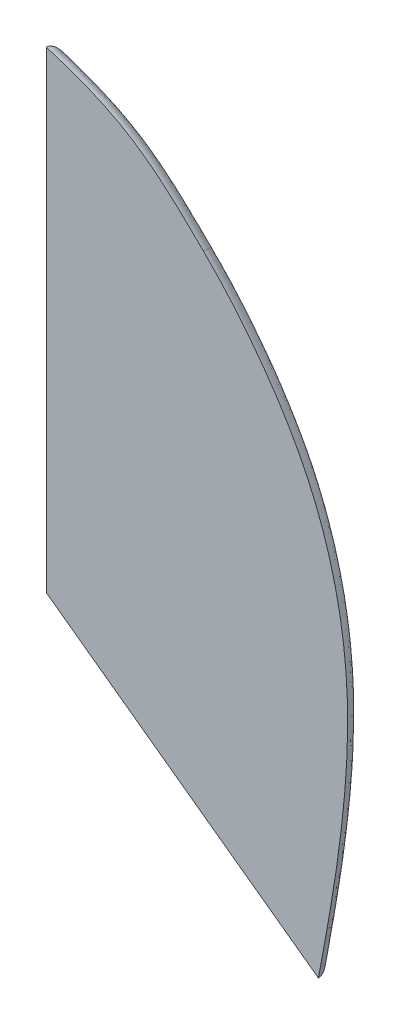
ISO-10303-21;
HEADER;
FILE_DESCRIPTION(('STEP AP214'),'2;1');
FILE_NAME('part.step','',(''),(''),'','','');
FILE_SCHEMA(('AUTOMOTIVE_DESIGN { 1 0 10303 214 1 1 1 1 }'));
ENDSEC;
DATA;
#1=APPLICATION_CONTEXT('core data for automotive mechanical design processes');
#2=APPLICATION_PROTOCOL_DEFINITION('international standard','automotive_design',2000,#1);
#3=PRODUCT_CONTEXT('',#1,'mechanical');
#4=PRODUCT('Part','Part','',(#3));
#5=PRODUCT_RELATED_PRODUCT_CATEGORY('part','',(#4));
#6=PRODUCT_DEFINITION_FORMATION('','',#4);
#7=PRODUCT_DEFINITION_CONTEXT('part definition',#1,'design');
#8=PRODUCT_DEFINITION('design','',#6,#7);
#9=PRODUCT_DEFINITION_SHAPE('','',#8);
#10=(LENGTH_UNIT() NAMED_UNIT(*) SI_UNIT(.MILLI.,.METRE.));
#11=(NAMED_UNIT(*) PLANE_ANGLE_UNIT() SI_UNIT($,.RADIAN.));
#12=(NAMED_UNIT(*) SI_UNIT($,.STERADIAN.) SOLID_ANGLE_UNIT());
#13=UNCERTAINTY_MEASURE_WITH_UNIT(LENGTH_MEASURE(1.E-05),#10,'distance_accuracy_value','');
#14=(GEOMETRIC_REPRESENTATION_CONTEXT(3) GLOBAL_UNCERTAINTY_ASSIGNED_CONTEXT((#13)) GLOBAL_UNIT_ASSIGNED_CONTEXT((#10,
#11,#12)) REPRESENTATION_CONTEXT('',''));
#15=CARTESIAN_POINT('',(0.,0.,0.));
#16=DIRECTION('',(0.,0.,1.));
#17=DIRECTION('',(1.,0.,0.));
#18=AXIS2_PLACEMENT_3D('',#15,#16,#17);
#19=CARTESIAN_POINT('',(125.590450076123,82.7587097255462,-1.14601855698823));
#20=DIRECTION('',(-0.809093584960124,0.587679819752122,-1.52475673134034E-05));
#21=DIRECTION('',(-0.415552384184587,-0.572133904193624,-0.707091940040803));
#22=AXIS2_PLACEMENT_3D('',#19,#20,#21);
#23=CYLINDRICAL_SURFACE('',#22,0.999999996270512);
#24=CARTESIAN_POINT('',(126.811863852623,81.8715438384854,-1.14599553580279));
#25=DIRECTION('',(-0.454048551687804,0.89097694256128,-2.31162691799491E-05));
#26=DIRECTION('',(-0.890976942861154,-0.454048551535003,1.1779567082714E-05));
#27=AXIS2_PLACEMENT_3D('',#24,#25,#26);
#28=ELLIPSE('',#27,1.12236349967131,0.999999999716051);
#29=CARTESIAN_POINT('',(126.811863852476,81.8715178975269,-2.14599553517501));
#30=VERTEX_POINT('',#29);
#31=CARTESIAN_POINT('',(125.811863851931,81.3619363190776,-1.14598231678155));
#32=VERTEX_POINT('',#31);
#33=EDGE_CURVE('E119',#30,#32,#28,.T.);
#34=ORIENTED_EDGE('',*,*,#33,.F.);
#35=DIRECTION('',(0.809093584947611,-0.58767981976935,1.524751426917E-05));
#36=VECTOR('',#35,1.);
#37=CARTESIAN_POINT('',(126.811863845189,81.8715179042601,-2.1459955351715));
#38=LINE('',#37,#36);
#39=CARTESIAN_POINT('',(143.791252344595,69.5386504092643,-2.1456755555384));
#40=VERTEX_POINT('',#39);
#41=EDGE_CURVE('E114',#30,#40,#38,.T.);
#42=ORIENTED_EDGE('',*,*,#41,.T.);
#43=CARTESIAN_POINT('',(144.482318319635,67.8007741785824,-1.14563046641121));
#44=CARTESIAN_POINT('',(144.482318336508,67.8007739689964,-1.15058067866123));
#45=CARTESIAN_POINT('',(144.482293002308,67.8008377007775,-1.15553090035431));
#46=CARTESIAN_POINT('',(144.482191871961,67.801092397399,-1.1654188458489));
#47=CARTESIAN_POINT('',(144.482116164599,67.8012831383753,-1.17035657632306));
#48=CARTESIAN_POINT('',(144.481924036355,67.8017672454629,-1.17975907664245));
#49=CARTESIAN_POINT('',(144.481812129172,67.8020492348666,-1.18422452805021));
#50=CARTESIAN_POINT('',(144.481520211337,67.8027849456108,-1.19406132727275));
#51=CARTESIAN_POINT('',(144.481330940507,67.8032620261052,-1.19943064553435));
#52=CARTESIAN_POINT('',(144.480749596651,67.8047273087882,-1.21367494042187));
#53=CARTESIAN_POINT('',(144.480305987994,67.8058453693435,-1.22253494444766));
#54=CARTESIAN_POINT('',(144.479467465317,67.8079594717313,-1.23668759127187));
#55=CARTESIAN_POINT('',(144.479122900127,67.8088283342445,-1.24200275515122));
#56=CARTESIAN_POINT('',(144.478374848225,67.8107139180863,-1.25263132892385));
#57=CARTESIAN_POINT('',(144.477971064377,67.811731384941,-1.25794458591091));
#58=CARTESIAN_POINT('',(144.476838241383,67.8145865796568,-1.27183373732352));
#59=CARTESIAN_POINT('',(144.476063172631,67.8165407130372,-1.28038221244633));
#60=CARTESIAN_POINT('',(144.47435969065,67.8208362420828,-1.2974743124396));
#61=CARTESIAN_POINT('',(144.473429568694,67.8231819534933,-1.30601667877199));
#62=CARTESIAN_POINT('',(144.471619303391,67.8277462336005,-1.32136063128442));
#63=CARTESIAN_POINT('',(144.470763484654,67.8299036669188,-1.32818337767669));
#64=CARTESIAN_POINT('',(144.468953226796,67.8344666156451,-1.34181547156111));
#65=CARTESIAN_POINT('',(144.467997821985,67.8368745597349,-1.34862387771123));
#66=CARTESIAN_POINT('',(144.465988478003,67.8419380967301,-1.36222278747765));
#67=CARTESIAN_POINT('',(144.464933545395,67.8445961856076,-1.36901221496943));
#68=CARTESIAN_POINT('',(144.462837231805,67.8498804063157,-1.38188444221119));
#69=CARTESIAN_POINT('',(144.461803106259,67.8524880606838,-1.38797604776079));
#70=CARTESIAN_POINT('',(144.458554345665,67.8606827243366,-1.40637510781812));
#71=CARTESIAN_POINT('',(144.456232713377,67.8665422255164,-1.4185435870602));
#72=CARTESIAN_POINT('',(144.451260232769,67.8790881765733,-1.44284283856432));
#73=CARTESIAN_POINT('',(144.448601732688,67.8857938227941,-1.45496206404236));
#74=CARTESIAN_POINT('',(144.442953571024,67.9000330963816,-1.4791368439916));
#75=CARTESIAN_POINT('',(144.439956352885,67.9075855637158,-1.49117951468662));
#76=CARTESIAN_POINT('',(144.433631449704,67.9235191511031,-1.51517251784532));
#77=CARTESIAN_POINT('',(144.430296456663,67.9319185615506,-1.52710873614414));
#78=CARTESIAN_POINT('',(144.423296993576,67.949543668366,-1.55086259909285));
#79=CARTESIAN_POINT('',(144.419625523696,67.958786885291,-1.56266516021873));
#80=CARTESIAN_POINT('',(144.412647795035,67.9763822603494,-1.58402045652676));
#81=CARTESIAN_POINT('',(144.409369672729,67.9846593123684,-1.59364456333861));
#82=CARTESIAN_POINT('',(144.402556302033,68.001883335318,-1.61288634668722));
#83=CARTESIAN_POINT('',(144.399016019849,68.0108437949294,-1.62249015214498));
#84=CARTESIAN_POINT('',(144.391670845877,68.0294342430514,-1.64167192874667));
#85=CARTESIAN_POINT('',(144.387861010428,68.0390767366544,-1.6512358584275));
#86=CARTESIAN_POINT('',(144.379971940413,68.059033612534,-1.67031578013776));
#87=CARTESIAN_POINT('',(144.375887945715,68.0693596831199,-1.67981755742893));
#88=CARTESIAN_POINT('',(144.367446762555,68.0906848706264,-1.69875064306884));
#89=CARTESIAN_POINT('',(144.363085019231,68.1016948794152,-1.70816763103557));
#90=CARTESIAN_POINT('',(144.354086169276,68.1243889839354,-1.72690769039866));
#91=CARTESIAN_POINT('',(144.349444752203,68.1360832376231,-1.73621637113935));
#92=CARTESIAN_POINT('',(144.339885977638,68.1601464271054,-1.75471575684966));
#93=CARTESIAN_POINT('',(144.334964586275,68.1725248368328,-1.76389203551853));
#94=CARTESIAN_POINT('',(144.324846992115,68.1979565383402,-1.782102065529));
#95=CARTESIAN_POINT('',(144.319647062893,68.2110186697712,-1.79112138354279));
#96=CARTESIAN_POINT('',(144.308975392566,68.2378176699786,-1.80899255218579));
#97=CARTESIAN_POINT('',(144.303500263898,68.2515627926034,-1.8178299859571));
#98=CARTESIAN_POINT('',(144.292282770825,68.2797269396043,-1.83531251135445));
#99=CARTESIAN_POINT('',(144.286537375447,68.2941536662737,-1.84394323294948));
#100=CARTESIAN_POINT('',(144.274786975946,68.3236808345079,-1.86098660238584));
#101=CARTESIAN_POINT('',(144.268779356505,68.3387884987565,-1.86938492233365));
#102=CARTESIAN_POINT('',(144.257235426763,68.3678458900955,-1.88496207255228));
#103=CARTESIAN_POINT('',(144.251705880389,68.3817761286315,-1.89218237747198));
#104=CARTESIAN_POINT('',(144.240334480251,68.4104203970516,-1.90656108576361));
#105=CARTESIAN_POINT('',(144.234489660258,68.425141767041,-1.91370250887938));
#106=CARTESIAN_POINT('',(144.222484918447,68.4553699623733,-1.92788816983891));
#107=CARTESIAN_POINT('',(144.216322147949,68.47088361514,-1.93491543269175));
#108=CARTESIAN_POINT('',(144.203680101432,68.5026964906788,-1.94883721907061));
#109=CARTESIAN_POINT('',(144.197198127927,68.5190020505324,-1.95571479222397));
#110=CARTESIAN_POINT('',(144.183919596831,68.5523988927747,-1.96930035942809));
#111=CARTESIAN_POINT('',(144.177120596251,68.5694961023158,-1.97599140268403));
#112=CARTESIAN_POINT('',(144.166784360635,68.5954904816259,-1.98578277977754));
#113=CARTESIAN_POINT('',(144.163267916473,68.6043342960307,-1.98904770309465));
#114=CARTESIAN_POINT('',(144.156839128202,68.6205085756085,-1.99489951596846));
#115=CARTESIAN_POINT('',(144.153928745562,68.6278330656892,-1.99750508214723));
#116=CARTESIAN_POINT('',(144.144868274824,68.6506403281161,-2.005483591241));
#117=CARTESIAN_POINT('',(144.138703854869,68.6661647053091,-2.01072188297141));
#118=CARTESIAN_POINT('',(144.125910995815,68.6983716714039,-2.0212121423817));
#119=CARTESIAN_POINT('',(144.1192796807,68.7150607935276,-2.02644049655536));
#120=CARTESIAN_POINT('',(144.105549346786,68.7495985221784,-2.03684924908729));
#121=CARTESIAN_POINT('',(144.098447435568,68.7674532878438,-2.04200539185285));
#122=CARTESIAN_POINT('',(144.08377474042,68.8043210532501,-2.05220581504935));
#123=CARTESIAN_POINT('',(144.076201176207,68.8233398215422,-2.05722523368008));
#124=CARTESIAN_POINT('',(144.06059816626,68.8625373496911,-2.06708278305968));
#125=CARTESIAN_POINT('',(144.052566796954,68.8827217844542,-2.0718952966537));
#126=CARTESIAN_POINT('',(144.037024473378,68.9217455288353,-2.08071712222869));
#127=CARTESIAN_POINT('',(144.029516960163,68.9405788271365,-2.08475918301449));
#128=CARTESIAN_POINT('',(144.014472271716,68.9782608065273,-2.09243053555223));
#129=CARTESIAN_POINT('',(144.006935218041,68.9971093306688,-2.09606083676565));
#130=CARTESIAN_POINT('',(143.99185914446,69.0348208563451,-2.10291184660509));
#131=CARTESIAN_POINT('',(143.984320181667,69.0536836899523,-2.10613360555579));
#132=CARTESIAN_POINT('',(143.969259680057,69.0914194870547,-2.11217485333849));
#133=CARTESIAN_POINT('',(143.961738149879,69.1102922822178,-2.11499541667848));
#134=CARTESIAN_POINT('',(143.946728676001,69.1480432490821,-2.12024279628622));
#135=CARTESIAN_POINT('',(143.939240697432,69.166921255151,-2.12267070179589));
#136=CARTESIAN_POINT('',(143.928049506968,69.1952641018923,-2.12602486165943));
#137=CARTESIAN_POINT('',(143.924329912146,69.2047057859193,-2.12709396263678));
#138=CARTESIAN_POINT('',(143.916717566631,69.2240268881837,-2.12918781012365));
#139=CARTESIAN_POINT('',(143.912824631962,69.2339066916546,-2.13020833023345));
#140=CARTESIAN_POINT('',(143.901128944345,69.2635168558312,-2.13312163533604));
#141=CARTESIAN_POINT('',(143.893296774385,69.2832500124677,-2.13486994600903));
#142=CARTESIAN_POINT('',(143.877605463052,69.3226831512686,-2.13797229935362));
#143=CARTESIAN_POINT('',(143.869746426358,69.3423831042337,-2.13932724700177));
#144=CARTESIAN_POINT('',(143.854018665135,69.3817444741933,-2.14164478226537));
#145=CARTESIAN_POINT('',(143.846150015012,69.4014058630905,-2.14260835069177));
#146=CARTESIAN_POINT('',(143.830424790264,69.4406865531956,-2.14414564515741));
#147=CARTESIAN_POINT('',(143.822568241018,69.4603058233973,-2.14472042456879));
#148=CARTESIAN_POINT('',(143.806887316982,69.4994983853095,-2.1454846657758));
#149=CARTESIAN_POINT('',(143.79906291515,69.5190716443962,-2.14567524556229));
#150=CARTESIAN_POINT('',(143.791252344052,69.5386504070282,-2.14567555553834));
#151=B_SPLINE_CURVE_WITH_KNOTS('',3,(#43,#44,#45,#46,#47,#48,#49,#50,#51,#52,#53,#54,#55,#56,
#57,#58,#59,#60,#61,#62,#63,#64,#65,#66,#67,#68,#69,#70,#71,#72,#73,#74,#75,#76,#77,#78,#79,#80,
#81,#82,#83,#84,#85,#86,#87,#88,#89,#90,#91,#92,#93,#94,#95,#96,#97,#98,#99,#100,#101,#102,#103,
#104,#105,#106,#107,#108,#109,#110,#111,#112,#113,#114,#115,#116,#117,#118,#119,#120,#121,#122,
#123,#124,#125,#126,#127,#128,#129,#130,#131,#132,#133,#134,#135,#136,#137,#138,#139,#140,#141,
#142,#143,#144,#145,#146,#147,#148,#149,#150),.UNSPECIFIED.,.F.,.F.,(4,2,2,2,2,2,2,2,2,2,2,2,2,
2,2,2,2,2,2,2,2,2,2,2,2,2,2,2,2,2,2,2,2,2,2,2,2,2,2,2,2,2,2,2,2,2,2,2,2,2,2,2,2,4),(0.,
0.0148501783463098,0.0296742510803923,0.043100093412507,0.0592793611188259,0.0860908196663251,
0.102279009523456,0.118551395977413,0.144950870834394,0.171663263997182,0.193278952420791,
0.215128201681626,0.23722491424751,0.257341699164225,0.298425897460246,0.340713613852489,
0.384273504745195,0.429166976284399,0.475448849916804,0.514768991354456,0.555568814812865,
0.59787479252804,0.641709183206085,0.687090499625878,0.734033926490721,0.782551694517738,
0.832653416634358,0.884346391731083,0.937635880838095,0.992525359944843,1.0424283831541,
1.09454695913692,1.1488765320327,1.2054101622761,1.26413869188339,1.29432318763931,
1.31922598071249,1.3717388226357,1.42784662540542,1.48752737664726,1.55075517831555,
1.61750021700445,1.6795166705403,1.74137764028678,1.80307619977326,1.86460627054508,
1.92596261392885,1.95657456092349,1.98857826307791,2.05248184354134,2.11623721984398,
2.17983182211097,2.24325342561419,2.30649020926803),.UNSPECIFIED.);
#152=CARTESIAN_POINT('',(144.482318312743,67.8007741630058,-1.14563046676126));
#153=VERTEX_POINT('',#152);
#154=EDGE_CURVE('E11',#153,#40,#151,.T.);
#155=ORIENTED_EDGE('',*,*,#154,.F.);
#156=DIRECTION('',(-0.809093584947609,0.587679819769348,-1.52477245357374E-05));
#157=VECTOR('',#156,1.);
#158=CARTESIAN_POINT('',(144.482318304735,67.800774158147,-1.14563046746204));
#159=LINE('',#158,#157);
#160=EDGE_CURVE('E104',#153,#32,#159,.T.);
#161=ORIENTED_EDGE('',*,*,#160,.T.);
#162=EDGE_LOOP('',(#34,#42,#155,#161));
#163=FACE_BOUND('',#162,.T.);
#164=ADVANCED_FACE('F40',(#163),#23,.T.);
#165=CARTESIAN_POINT('',(144.482318319635,67.8007741785824,-1.14563046641121));
#166=CARTESIAN_POINT('',(145.213123430634,71.654923868336,-1.14573046024207));
#167=CARTESIAN_POINT('',(146.321803906748,77.7966914906592,-1.14588980511302));
#168=CARTESIAN_POINT('',(146.694942994877,87.4595978575819,-1.14614050475584));
#169=CARTESIAN_POINT('',(144.922204221095,95.6294993400638,-1.14635247016296));
#170=CARTESIAN_POINT('',(141.637842445866,101.056520583461,-1.14649327354055));
#171=CARTESIAN_POINT('',(139.541330290064,103.780432607108,-1.1465639453254));
#172=CARTESIAN_POINT('',(138.33236116076,105.266187251436,-1.14660249320236));
#173=CARTESIAN_POINT('',(137.24414315842,106.41628000436,-1.14663233241689));
#174=CARTESIAN_POINT('',(136.591131158806,107.056283775076,-1.14664893737178));
#175=CARTESIAN_POINT('',(144.482318320295,67.8007482339977,-2.14563046607464));
#176=CARTESIAN_POINT('',(145.213123431006,71.6548979234805,-2.1457304599055));
#177=CARTESIAN_POINT('',(146.321803907384,77.7966655465286,-2.14588980477645));
#178=CARTESIAN_POINT('',(146.694942995333,87.459571912568,-2.14614050441928));
#179=CARTESIAN_POINT('',(144.922204221634,95.6294733959754,-2.14635246982644));
#180=CARTESIAN_POINT('',(141.637842446406,101.056494638617,-2.14649327320399));
#181=CARTESIAN_POINT('',(139.541330290578,103.78040666263,-2.14656394498887));
#182=CARTESIAN_POINT('',(138.332361161287,105.266161306808,-2.14660249286579));
#183=CARTESIAN_POINT('',(137.244143158936,106.416254059839,-2.14663233208036));
#184=CARTESIAN_POINT('',(136.591131159327,107.056257830518,-2.14664893703524));
#185=CARTESIAN_POINT('',(143.499935123893,67.9876258822134,-2.14563531504379));
#186=CARTESIAN_POINT('',(144.228772451117,71.8324129215384,-2.14573506596585));
#187=CARTESIAN_POINT('',(145.329139543959,77.9341427586998,-2.14589337207847));
#188=CARTESIAN_POINT('',(145.686027992747,87.3899093908195,-2.14613869758086));
#189=CARTESIAN_POINT('',(143.974847296871,95.2507333355182,-2.14634264407579));
#190=CARTESIAN_POINT('',(140.804319546754,100.500859782968,-2.14647885793674));
#191=CARTESIAN_POINT('',(138.76244030875,103.153073441316,-2.14654766951083));
#192=CARTESIAN_POINT('',(137.565959325887,104.621977642148,-2.14658578020392));
#193=CARTESIAN_POINT('',(136.547267388168,105.697229915292,-2.14661367767915));
#194=CARTESIAN_POINT('',(135.874594773373,106.358708113811,-2.14663083978878));
#195=(BOUNDED_SURFACE() B_SPLINE_SURFACE(2,3,((#165,#166,#167,#168,#169,#170,#171,#172,#173,
#174),(#175,#176,#177,#178,#179,#180,#181,#182,#183,#184),(#185,#186,#187,#188,#189,#190,#191,
#192,#193,#194)),.UNSPECIFIED.,.F.,.F.,.F.) B_SPLINE_SURFACE_WITH_KNOTS((3,3),(4,1,1,1,1,1,1,4),
(0.,1.57079632700827),(-1.0797520247796E-10,11.7431313152028,18.5717809273118,28.2978183978038,
35.5405647191903,36.7544778082343,38.3796799892132,41.2057858997997),
.UNSPECIFIED.) GEOMETRIC_REPRESENTATION_ITEM() RATIONAL_B_SPLINE_SURFACE(((1.,1.,1.,1.,1.,1.,1.,
1.,1.,1.),(0.707106781111109,0.707106781237663,0.707106781161074,0.707106781197957,
0.707106781177582,0.707106781187554,0.70710678118583,0.707106781187182,0.707106781186161,
0.707106781186557),(1.,1.,1.,1.,1.,1.,1.,1.,1.,1.))) REPRESENTATION_ITEM('') SURFACE());
#196=CARTESIAN_POINT('',(143.79125234464,69.5386504105194,-2.14567555553843));
#197=CARTESIAN_POINT('',(144.40954241628,72.8702531569204,-2.14576199217823));
#198=CARTESIAN_POINT('',(145.349044719331,78.4615307807123,-2.14590705491737));
#199=CARTESIAN_POINT('',(145.686027992747,87.3899093908195,-2.14613869758086));
#200=CARTESIAN_POINT('',(143.974847296871,95.2507333355182,-2.14634264407579));
#201=CARTESIAN_POINT('',(140.804319546754,100.500859782968,-2.14647885793674));
#202=CARTESIAN_POINT('',(138.76244030875,103.153073441316,-2.14654766951083));
#203=CARTESIAN_POINT('',(137.579088860564,104.605858682534,-2.1465853619978));
#204=CARTESIAN_POINT('',(136.575706209772,105.667180529512,-2.14661289804632));
#205=CARTESIAN_POINT('',(135.918948305754,106.315024772984,-2.14662970642072));
#206=(BOUNDED_CURVE() B_SPLINE_CURVE(3,(#196,#197,#198,#199,#200,#201,#202,#203,#204,#205),
.UNSPECIFIED.,.F.,.F.) B_SPLINE_CURVE_WITH_KNOTS((4,1,1,1,1,1,1,4),(1.57828878944919,
11.7431313152028,18.5717809273118,28.2978183978038,35.5405647191903,36.7544778082343,
38.3796799892132,41.1436188290223),
.UNSPECIFIED.) CURVE() GEOMETRIC_REPRESENTATION_ITEM() RATIONAL_B_SPLINE_CURVE((1.,1.,1.,1.,1.,
1.,1.,1.,1.,1.)) REPRESENTATION_ITEM(''));
#207=CARTESIAN_POINT('',(135.918933669779,106.315011061286,-2.14662970606499));
#208=VERTEX_POINT('',#207);
#209=EDGE_CURVE('E92',#40,#208,#206,.T.);
#210=CARTESIAN_POINT('',(135.918947807492,106.315025264483,-2.14662970643348));
#211=CARTESIAN_POINT('',(135.929089161937,106.32589719804,-2.1466302308001));
#212=CARTESIAN_POINT('',(135.939235417158,106.336764575145,-2.14629889548868));
#213=CARTESIAN_POINT('',(135.959694200064,106.358661042221,-2.14496250956649));
#214=CARTESIAN_POINT('',(135.970006514501,106.369689615832,-2.14394571552296));
#215=CARTESIAN_POINT('',(135.990767485053,106.391879154069,-2.14120563798652));
#216=CARTESIAN_POINT('',(136.001215544771,106.403039256925,-2.13947084842009));
#217=CARTESIAN_POINT('',(136.022215003021,106.425459525426,-2.13526531703195));
#218=CARTESIAN_POINT('',(136.03276543931,106.436718500822,-2.13278342016633));
#219=CARTESIAN_POINT('',(136.053933695506,106.459301322148,-2.12705767934227));
#220=CARTESIAN_POINT('',(136.064550214643,106.470623676159,-2.12380313861585));
#221=CARTESIAN_POINT('',(136.085811951989,106.493295411905,-2.11651032018336));
#222=CARTESIAN_POINT('',(136.096455569243,106.50464303719,-2.11246191210762));
#223=CARTESIAN_POINT('',(136.117730374802,106.527325104994,-2.10356432682265));
#224=CARTESIAN_POINT('',(136.128359711275,106.538657574055,-2.09870568909749));
#225=CARTESIAN_POINT('',(136.149562743926,106.561267104401,-2.08817592587661));
#226=CARTESIAN_POINT('',(136.160134397388,106.572542032807,-2.08249610604727));
#227=CARTESIAN_POINT('',(136.181177198137,106.594992662211,-2.07031805704335));
#228=CARTESIAN_POINT('',(136.19164618174,106.606166137797,-2.06381198557748));
#229=CARTESIAN_POINT('',(136.212437613487,106.628368930146,-2.04998171669203));
#230=CARTESIAN_POINT('',(136.222757855577,106.639396003968,-2.04265060138308));
#231=CARTESIAN_POINT('',(136.243205162113,106.661260480457,-2.02717704425373));
#232=CARTESIAN_POINT('',(136.253330063786,106.672095704098,-2.01902866498127));
#233=CARTESIAN_POINT('',(136.27334001104,106.693530979359,-2.00193409286904));
#234=CARTESIAN_POINT('',(136.283223027607,106.704129001877,-1.99298298031027));
#235=CARTESIAN_POINT('',(136.302703161872,106.725044933058,-1.97430324822172));
#236=CARTESIAN_POINT('',(136.3122984776,106.735361050284,-1.96457074346776));
#237=CARTESIAN_POINT('',(136.331158241873,106.7556696251,-1.94435524682815));
#238=CARTESIAN_POINT('',(136.340421207625,106.765660617215,-1.93386939915073));
#239=CARTESIAN_POINT('',(136.358573742121,106.785276586433,-1.91218083481145));
#240=CARTESIAN_POINT('',(136.367462238937,106.794900506201,-1.90097626492825));
#241=CARTESIAN_POINT('',(136.384823603238,106.813744836664,-1.87788983510508));
#242=CARTESIAN_POINT('',(136.393295889427,106.822964681177,-1.86600707536401));
#243=CARTESIAN_POINT('',(136.408674149328,106.839736216351,-1.84326613471447));
#244=CARTESIAN_POINT('',(136.415636654267,106.847344491582,-1.83248774706201));
#245=CARTESIAN_POINT('',(136.429353990351,106.862356529554,-1.81026109599164));
#246=CARTESIAN_POINT('',(136.436101908006,106.869753184889,-1.79880375872202));
#247=CARTESIAN_POINT('',(136.449344017483,106.884300137145,-1.77522941172739));
#248=CARTESIAN_POINT('',(136.45583124102,106.891443381206,-1.76310413585329));
#249=CARTESIAN_POINT('',(136.468507798583,106.90543963956,-1.73821055080506));
#250=CARTESIAN_POINT('',(136.474690259804,106.912285723533,-1.72543484394726));
#251=CARTESIAN_POINT('',(136.486712853047,106.925644616402,-1.69926404335023));
#252=CARTESIAN_POINT('',(136.492546312287,106.932150735954,-1.68586246886822));
#253=CARTESIAN_POINT('',(136.50382763764,106.944787527424,-1.65847059473672));
#254=CARTESIAN_POINT('',(136.509269154497,106.950911863256,-1.64447475640995));
#255=CARTESIAN_POINT('',(136.519725002864,106.962744647736,-1.61593200470419));
#256=CARTESIAN_POINT('',(136.524733430738,106.968447230056,-1.60138049620592));
#257=CARTESIAN_POINT('',(136.534283956016,106.97939845274,-1.57177081966698));
#258=CARTESIAN_POINT('',(136.538820716608,106.984641810242,-1.55670897598016));
#259=CARTESIAN_POINT('',(136.547391896135,106.994639610155,-1.5261294270917));
#260=CARTESIAN_POINT('',(136.551421660371,106.999389461074,-1.51060891578677));
#261=CARTESIAN_POINT('',(136.558946639617,107.008368999854,-1.47916866002185));
#262=CARTESIAN_POINT('',(136.562437987646,107.012594885615,-1.46324690395321));
#263=CARTESIAN_POINT('',(136.568858332307,107.020499558017,-1.43106590811743));
#264=CARTESIAN_POINT('',(136.571784341685,107.024175416454,-1.41480535301656));
#265=CARTESIAN_POINT('',(136.577051135469,107.030957917124,-1.38201277940043));
#266=CARTESIAN_POINT('',(136.579389887342,107.034062572746,-1.36548002350737));
#267=CARTESIAN_POINT('',(136.583464627714,107.039685763278,-1.33221237065057));
#268=CARTESIAN_POINT('',(136.585199593491,107.042203301342,-1.31547717991699));
#269=CARTESIAN_POINT('',(136.588054895663,107.046640891032,-1.28187622765066));
#270=CARTESIAN_POINT('',(136.589175252349,107.048560962382,-1.2650104704471));
#271=CARTESIAN_POINT('',(136.59079516675,107.05179780987,-1.23122108228913));
#272=CARTESIAN_POINT('',(136.591295797998,107.05311562677,-1.21429760248132));
#273=CARTESIAN_POINT('',(136.591676363168,107.05514827836,-1.18046549712301));
#274=CARTESIAN_POINT('',(136.591558409589,107.055865155572,-1.16355701799142));
#275=CARTESIAN_POINT('',(136.591131158806,107.056283775076,-1.14664893737178));
#276=B_SPLINE_CURVE_WITH_KNOTS('',3,(#210,#211,#212,#213,#214,#215,#216,#217,#218,#219,#220,
#221,#222,#223,#224,#225,#226,#227,#228,#229,#230,#231,#232,#233,#234,#235,#236,#237,#238,#239,
#240,#241,#242,#243,#244,#245,#246,#247,#248,#249,#250,#251,#252,#253,#254,#255,#256,#257,#258,
#259,#260,#261,#262,#263,#264,#265,#266,#267,#268,#269,#270,#271,#272,#273,#274,#275),
.UNSPECIFIED.,.F.,.F.,(4,2,2,2,2,2,2,2,2,2,2,2,2,2,2,2,2,2,2,2,2,2,2,2,2,2,2,2,2,2,2,2,4),(0.,
0.0445991902026963,0.0899825634478636,0.136123250153619,0.182990255289048,0.230548413746825,
0.278758394090898,0.32757675517949,0.376956059228015,0.426845043702858,0.477188853046201,
0.527929329667121,0.579005361951394,0.630353285308595,0.681907330567821,0.733600112444209,
0.785363149398879,0.830101621302767,0.875732561444587,0.922204487708636,0.969460500240784,
1.01743845315485,1.06607121764613,1.11528703764257,1.16500997626845,1.21516044834775,
1.26565583108412,1.31641114208664,1.36733977124373,1.41835425074273,1.4693670459356,
1.52029134886681,1.57104185616874),.UNSPECIFIED.);
#277=CARTESIAN_POINT('',(136.591131000824,107.056283927313,-1.14664896070818));
#278=VERTEX_POINT('',#277);
#279=EDGE_CURVE('E53',#208,#278,#276,.T.);
#280=CARTESIAN_POINT('',(136.591131473377,107.056283466772,-1.14664893736378));
#281=CARTESIAN_POINT('',(137.244143380302,106.416279769862,-1.1466323324108));
#282=CARTESIAN_POINT('',(138.332361257602,105.266187132423,-1.14660249319927));
#283=CARTESIAN_POINT('',(139.541330290064,103.780432607108,-1.1465639453254));
#284=CARTESIAN_POINT('',(141.637842445866,101.056520583461,-1.14649327354055));
#285=CARTESIAN_POINT('',(144.922204221095,95.6294993400638,-1.14635247016296));
#286=CARTESIAN_POINT('',(146.694942994877,87.4595978575819,-1.14614050475584));
#287=CARTESIAN_POINT('',(146.321803906749,77.7966914906961,-1.14588980511302));
#288=CARTESIAN_POINT('',(145.213123430647,71.6549238684074,-1.14573046024208));
#289=CARTESIAN_POINT('',(144.482318319655,67.8007741786888,-1.14563046641121));
#290=(BOUNDED_CURVE() B_SPLINE_CURVE(3,(#280,#281,#282,#283,#284,#285,#286,#287,#288,#289),
.UNSPECIFIED.,.F.,.F.) B_SPLINE_CURVE_WITH_KNOTS((4,1,1,1,1,1,1,4),(-41.2057854460001,
-38.3796799892132,-36.7544778082343,-35.5405647191903,-28.2978183978038,-18.5717809273118,
-11.7431313152028,0.),
.UNSPECIFIED.) CURVE() GEOMETRIC_REPRESENTATION_ITEM() RATIONAL_B_SPLINE_CURVE((1.,1.,1.,1.,1.,
1.,1.,1.,1.,1.)) REPRESENTATION_ITEM(''));
#291=EDGE_CURVE('E90',#278,#153,#290,.T.);
#292=ORIENTED_EDGE('',*,*,#154,.T.);
#293=ORIENTED_EDGE('',*,*,#209,.T.);
#294=ORIENTED_EDGE('',*,*,#279,.T.);
#295=ORIENTED_EDGE('',*,*,#291,.T.);
#296=EDGE_LOOP('',(#292,#293,#294,#295));
#297=FACE_BOUND('',#296,.T.);
#298=ADVANCED_FACE('F88',(#297),#195,.T.);
#299=CARTESIAN_POINT('',(136.619493956167,107.028453714624,-1.14664821531906));
#300=CARTESIAN_POINT('',(135.858621189907,107.770926932868,-1.14666747884023));
#301=CARTESIAN_POINT('',(134.391719524007,109.224536377912,-1.14670519288493));
#302=CARTESIAN_POINT('',(132.249953675655,110.960440522982,-1.14675023124762));
#303=CARTESIAN_POINT('',(129.384616752772,112.596035261708,-1.14679266753042));
#304=CARTESIAN_POINT('',(127.342002064282,113.331103058262,-1.14681173959532));
#305=CARTESIAN_POINT('',(125.811863852794,113.784362277247,-1.14682350000457));
#306=CARTESIAN_POINT('',(136.619493956687,107.028427770066,-2.14664821498221));
#307=CARTESIAN_POINT('',(135.858621187514,107.770900989942,-2.14666747851056));
#308=CARTESIAN_POINT('',(134.39171953155,109.224510430334,-2.14670519254189));
#309=CARTESIAN_POINT('',(132.249953669224,110.960414580264,-2.14675023091358));
#310=CARTESIAN_POINT('',(129.384616761712,112.596009316978,-2.14679266719183));
#311=CARTESIAN_POINT('',(127.342002055847,113.331077110244,-2.14681173926018));
#312=CARTESIAN_POINT('',(125.81186385583,113.784336341303,-2.14682349966828));
#313=CARTESIAN_POINT('',(135.918846166126,106.314920466362,-2.14662970371459));
#314=CARTESIAN_POINT('',(135.161522758256,107.054489101526,-2.14664889189014));
#315=CARTESIAN_POINT('',(133.70270492438,108.497032386181,-2.1466863187974));
#316=CARTESIAN_POINT('',(131.67595454508,110.135851468104,-2.146728838289));
#317=CARTESIAN_POINT('',(128.990270904984,111.670007568464,-2.14676864268861));
#318=CARTESIAN_POINT('',(127.012969013854,112.387244026169,-2.14678725210043));
#319=CARTESIAN_POINT('',(125.531500877839,112.824442284674,-2.14679859578689));
#320=(BOUNDED_SURFACE() B_SPLINE_SURFACE(2,3,((#299,#300,#301,#302,#303,#304,#305),(#306,#307,
#308,#309,#310,#311,#312),(#313,#314,#315,#316,#317,#318,#319)),.UNSPECIFIED.,.F.,.F.,
.F.) B_SPLINE_SURFACE_WITH_KNOTS((3,3),(4,1,1,1,4),(0.,1.57079634025523),(-0.0391841455874279,
3.13560186252464,6.11713441541781,7.7551572769279,12.3936851885584),
.UNSPECIFIED.) GEOMETRIC_REPRESENTATION_ITEM() RATIONAL_B_SPLINE_SURFACE(((1.,1.,1.,1.,1.,1.,
1.),(0.707106781186176,0.707106781260901,0.707106780769376,0.707106781838213,0.707106779779989,
0.707106784361231,0.707106776427601),(1.,1.,1.,1.,1.,1.,1.))) REPRESENTATION_ITEM('') SURFACE());
#321=CARTESIAN_POINT('',(135.918846133563,106.314920498161,-2.14662970371541));
#322=CARTESIAN_POINT('',(135.161522736692,107.05448912285,-2.1466488918907));
#323=CARTESIAN_POINT('',(133.702704912548,108.497032395748,-2.14668631879765));
#324=CARTESIAN_POINT('',(131.67595454508,110.135851468104,-2.146728838289));
#325=CARTESIAN_POINT('',(129.379933399858,111.447418770339,-2.14676286751784));
#326=CARTESIAN_POINT('',(127.852123985533,112.065466062398,-2.1467789032767));
#327=CARTESIAN_POINT('',(126.81186385345,112.419237566607,-2.14678808226333));
#328=(BOUNDED_CURVE() B_SPLINE_CURVE(3,(#321,#322,#323,#324,#325,#326,#327),.UNSPECIFIED.,.F.,
.F.) B_SPLINE_CURVE_WITH_KNOTS((4,1,1,1,4),(-0.0391841000850563,3.13560186252464,
6.11713441541781,7.7551572769279,11.050441407826),
.UNSPECIFIED.) CURVE() GEOMETRIC_REPRESENTATION_ITEM() RATIONAL_B_SPLINE_CURVE((1.,1.,1.,1.,1.,
1.,1.)) REPRESENTATION_ITEM(''));
#329=CARTESIAN_POINT('',(126.811863853095,112.419237566613,-2.14678808226333));
#330=VERTEX_POINT('',#329);
#331=EDGE_CURVE('E131',#208,#330,#328,.T.);
#332=CARTESIAN_POINT('',(126.811863853146,112.419237566711,-2.14678808226333));
#333=CARTESIAN_POINT('',(126.802621752374,112.432135917133,-2.14678824081058));
#334=CARTESIAN_POINT('',(126.793372171542,112.445028959956,-2.14666069337229));
#335=CARTESIAN_POINT('',(126.773815228232,112.472267597458,-2.14611974808105));
#336=CARTESIAN_POINT('',(126.763506975978,112.48661194694,-2.14567554609244));
#337=CARTESIAN_POINT('',(126.7418279406,112.516767786329,-2.14440445382412));
#338=CARTESIAN_POINT('',(126.730457289496,112.532577914583,-2.14354280101316));
#339=CARTESIAN_POINT('',(126.706645763381,112.56567371739,-2.14132540973491));
#340=CARTESIAN_POINT('',(126.694205559837,112.582957271318,-2.13993059388579));
#341=CARTESIAN_POINT('',(126.668235984538,112.618993839355,-2.13652250837833));
#342=CARTESIAN_POINT('',(126.654706744315,112.637742834649,-2.13446573839297));
#343=CARTESIAN_POINT('',(126.62427459308,112.67989657396,-2.12919056413521));
#344=CARTESIAN_POINT('',(126.607378850826,112.703286472821,-2.12581010816819));
#345=CARTESIAN_POINT('',(126.57637224746,112.746174957098,-2.11875454008253));
#346=CARTESIAN_POINT('',(126.562253459488,112.765690348494,-2.11521578176999));
#347=CARTESIAN_POINT('',(126.536809562926,112.80078046929,-2.10824915301318));
#348=CARTESIAN_POINT('',(126.525480986585,112.81637555613,-2.10493628674673));
#349=CARTESIAN_POINT('',(126.505642232061,112.843622227005,-2.09876220410912));
#350=CARTESIAN_POINT('',(126.497129670448,112.855292874339,-2.09599265929077));
#351=CARTESIAN_POINT('',(126.482955995511,112.874714437143,-2.09116995639756));
#352=CARTESIAN_POINT('',(126.477288432659,112.882477661931,-2.08918500655867));
#353=CARTESIAN_POINT('',(126.458142783619,112.908735800653,-2.08227035934754));
#354=CARTESIAN_POINT('',(126.444720065026,112.927200741988,-2.07707018192665));
#355=CARTESIAN_POINT('',(126.418443875033,112.963324089483,-2.066216947906));
#356=CARTESIAN_POINT('',(126.405587462364,112.980987395117,-2.06058725545652));
#357=CARTESIAN_POINT('',(126.380457124096,113.01549403402,-2.04893061787557));
#358=CARTESIAN_POINT('',(126.368179781748,113.032342817631,-2.04292721463173));
#359=CARTESIAN_POINT('',(126.344205327191,113.065201249462,-2.03058534501464));
#360=CARTESIAN_POINT('',(126.33250485706,113.081217242021,-2.02427030269598));
#361=CARTESIAN_POINT('',(126.309688034152,113.112400069427,-2.01136564882564));
#362=CARTESIAN_POINT('',(126.298568104571,113.127573921951,-2.00479933750484));
#363=CARTESIAN_POINT('',(126.276916778939,113.157067434595,-1.99145197213157));
#364=CARTESIAN_POINT('',(126.266381500704,113.171394702094,-1.98469404176278));
#365=CARTESIAN_POINT('',(126.245905487325,113.199195470653,-1.97102150689153));
#366=CARTESIAN_POINT('',(126.235960407622,113.212677042264,-1.96412983837857));
#367=CARTESIAN_POINT('',(126.216672455165,113.23879174908,-1.95024535157567));
#368=CARTESIAN_POINT('',(126.20732457997,113.251433289519,-1.94327530895309));
#369=CARTESIAN_POINT('',(126.189238264954,113.275877004242,-1.92928760510665));
#370=CARTESIAN_POINT('',(126.180494036908,113.287687821748,-1.92229256425432));
#371=CARTESIAN_POINT('',(126.163628549171,113.310484614363,-1.90830236517223));
#372=CARTESIAN_POINT('',(126.155500174995,113.321479253469,-1.90132990789181));
#373=CARTESIAN_POINT('',(126.13718479093,113.346281009659,-1.88506012088048));
#374=CARTESIAN_POINT('',(126.127038044442,113.360041245103,-1.87564555759539));
#375=CARTESIAN_POINT('',(126.107243885509,113.386879304182,-1.85647355785214));
#376=CARTESIAN_POINT('',(126.097590509521,113.399965366489,-1.84673381699111));
#377=CARTESIAN_POINT('',(126.078788404169,113.425444336311,-1.82694426505846));
#378=CARTESIAN_POINT('',(126.069633203306,113.437846285775,-1.816912271923));
#379=CARTESIAN_POINT('',(126.05182768576,113.461946818985,-1.7965750453235));
#380=CARTESIAN_POINT('',(126.043170493953,113.473655311253,-1.78628759475275));
#381=CARTESIAN_POINT('',(126.026363539171,113.49636236398,-1.76547545106255));
#382=CARTESIAN_POINT('',(126.018206383835,113.5073716684,-1.75496847459425));
#383=CARTESIAN_POINT('',(126.002402443031,113.528676538103,-1.73375326006546));
#384=CARTESIAN_POINT('',(125.994747685267,113.538983671405,-1.72306260279727));
#385=CARTESIAN_POINT('',(125.979952200607,113.558883251744,-1.70151544495256));
#386=CARTESIAN_POINT('',(125.972802844773,113.568488068319,-1.69067632051325));
#387=CARTESIAN_POINT('',(125.959022773195,113.586984706518,-1.66886670326633));
#388=CARTESIAN_POINT('',(125.952382684663,113.595889673632,-1.65791330810414));
#389=CARTESIAN_POINT('',(125.939625225733,113.612990879797,-1.63590908079269));
#390=CARTESIAN_POINT('',(125.933497702237,113.621201004073,-1.62487496055522));
#391=CARTESIAN_POINT('',(125.921773974135,113.636918852487,-1.60274014951616));
#392=CARTESIAN_POINT('',(125.916166628115,113.644441167262,-1.59165574368711));
#393=CARTESIAN_POINT('',(125.904488090855,113.66012211177,-1.56739989338648));
#394=CARTESIAN_POINT('',(125.898468558584,113.668213491693,-1.55415987370575));
#395=CARTESIAN_POINT('',(125.887047816809,113.683559002811,-1.52748001628183));
#396=CARTESIAN_POINT('',(125.881634358983,113.690829761731,-1.51405504545484));
#397=CARTESIAN_POINT('',(125.873931853145,113.701170591006,-1.49366621636963));
#398=CARTESIAN_POINT('',(125.871457240887,113.704492096866,-1.48689855611442));
#399=CARTESIAN_POINT('',(125.866662285056,113.710926131461,-1.47333078738501));
#400=CARTESIAN_POINT('',(125.864340337942,113.714040837734,-1.46653228256266));
#401=CARTESIAN_POINT('',(125.859851138264,113.72006100723,-1.45290826618337));
#402=CARTESIAN_POINT('',(125.857682264804,113.722968667324,-1.44608425958638));
#403=CARTESIAN_POINT('',(125.853499485667,113.728574863791,-1.43241439791117));
#404=CARTESIAN_POINT('',(125.85148394815,113.731275605435,-1.4255699476707));
#405=CARTESIAN_POINT('',(125.847608155502,113.736468267355,-1.41186438919109));
#406=CARTESIAN_POINT('',(125.845746262155,113.738962392226,-1.40500458044871));
#407=CARTESIAN_POINT('',(125.842178278262,113.743742297481,-1.39127341351219));
#408=CARTESIAN_POINT('',(125.840470546379,113.746030272048,-1.38440324612825));
#409=CARTESIAN_POINT('',(125.837063217601,113.750596466903,-1.37003423763019));
#410=CARTESIAN_POINT('',(125.835374621019,113.752860038448,-1.36252811927322));
#411=CARTESIAN_POINT('',(125.832174346605,113.757149936049,-1.34748642665249));
#412=CARTESIAN_POINT('',(125.83066122568,113.759178197338,-1.33995171162869));
#413=CARTESIAN_POINT('',(125.827812026954,113.762996962269,-1.32485935164236));
#414=CARTESIAN_POINT('',(125.826474555469,113.764789337812,-1.31730244411447));
#415=CARTESIAN_POINT('',(125.823976724177,113.768136138662,-1.30217234319672));
#416=CARTESIAN_POINT('',(125.822815028598,113.769692358875,-1.29459976768823));
#417=CARTESIAN_POINT('',(125.820668695257,113.772567027166,-1.27944486498259));
#418=CARTESIAN_POINT('',(125.81968278884,113.773887179146,-1.27186304157999));
#419=CARTESIAN_POINT('',(125.81786603389,113.776320520275,-1.25650347763022));
#420=CARTESIAN_POINT('',(125.817038359029,113.777429471964,-1.24872469341864));
#421=CARTESIAN_POINT('',(125.815199837494,113.779892603882,-1.22927056041326));
#422=CARTESIAN_POINT('',(125.814299929329,113.781098049444,-1.21756528808822));
#423=CARTESIAN_POINT('',(125.813027150416,113.782803111235,-1.19603281629271));
#424=CARTESIAN_POINT('',(125.812591654543,113.783386590558,-1.18621583509708));
#425=CARTESIAN_POINT('',(125.812155435146,113.783971156798,-1.17146738976548));
#426=CARTESIAN_POINT('',(125.812046199137,113.784117570532,-1.1665444270375));
#427=CARTESIAN_POINT('',(125.81190035049,113.784313142494,-1.1566888668596));
#428=CARTESIAN_POINT('',(125.811863835775,113.784362169586,-1.15175626535902));
#429=CARTESIAN_POINT('',(125.811863852794,113.784362277247,-1.14682350000457));
#430=B_SPLINE_CURVE_WITH_KNOTS('',3,(#332,#333,#334,#335,#336,#337,#338,#339,#340,#341,#342,
#343,#344,#345,#346,#347,#348,#349,#350,#351,#352,#353,#354,#355,#356,#357,#358,#359,#360,#361,
#362,#363,#364,#365,#366,#367,#368,#369,#370,#371,#372,#373,#374,#375,#376,#377,#378,#379,#380,
#381,#382,#383,#384,#385,#386,#387,#388,#389,#390,#391,#392,#393,#394,#395,#396,#397,#398,#399,
#400,#401,#402,#403,#404,#405,#406,#407,#408,#409,#410,#411,#412,#413,#414,#415,#416,#417,#418,
#419,#420,#421,#422,#423,#424,#425,#426,#427,#428,#429),.UNSPECIFIED.,.F.,.F.,(4,2,2,2,2,2,2,2,
2,2,2,2,2,2,2,2,2,2,2,2,2,2,2,2,2,2,2,2,2,2,2,2,2,2,2,2,2,2,2,2,2,2,2,2,2,2,2,2,4),(0.,
0.0476026725138219,0.100608843463216,0.159085243493982,0.223101983309178,0.292731255023643,
0.379870098404479,0.452898542526627,0.511568100263902,0.555691242130059,0.585134961120389,
0.655363014062385,0.723035667936641,0.788110828701409,0.850549897555434,0.91031806665338,
0.967384561048292,1.02172283796464,1.07331075878401,1.12213075400436,1.16817000750505,
1.22670935318938,1.28356196994217,1.3387249431181,1.39219817767362,1.44398484483857,
1.49409185684155,1.54253037429221,1.58931635163284,1.63447112652293,1.67802205885986,
1.72792601253208,1.77649241512419,1.80029310553296,1.82378006245266,1.84696112170824,
1.86984462329274,1.89243943228886,1.91475495837705,1.93880913915259,1.96264886584575,
1.98628624755298,2.00973385033004,2.03300470476815,2.05670213902602,2.09208527826567,
2.12160491409556,2.13638262390379,2.15118021910236),.UNSPECIFIED.);
#431=CARTESIAN_POINT('',(125.81186385302,113.784362276814,-1.14682350017392));
#432=VERTEX_POINT('',#431);
#433=EDGE_CURVE('E76',#432,#330,#430,.F.);
#434=CARTESIAN_POINT('',(125.81186385323,113.784362277118,-1.14682350000457));
#435=CARTESIAN_POINT('',(127.342002064569,113.331103058159,-1.14681173959532));
#436=CARTESIAN_POINT('',(129.384616752909,112.59603526163,-1.14679266753041));
#437=CARTESIAN_POINT('',(132.249953675655,110.960440522982,-1.14675023124762));
#438=CARTESIAN_POINT('',(134.38085076618,109.233345520974,-1.14670542143982));
#439=CARTESIAN_POINT('',(135.839762523625,107.789602112692,-1.14666796336968));
#440=CARTESIAN_POINT('',(136.591057412846,107.05620774992,-1.14664893539952));
#441=(BOUNDED_CURVE() B_SPLINE_CURVE(3,(#434,#435,#436,#437,#438,#439,#440),.UNSPECIFIED.,.F.,
.F.) B_SPLINE_CURVE_WITH_KNOTS((4,1,1,1,4),(-12.393685188118,-7.7551572769279,-6.11713441541781,
-3.13560186252464,-0.000369575659619499),
.UNSPECIFIED.) CURVE() GEOMETRIC_REPRESENTATION_ITEM() RATIONAL_B_SPLINE_CURVE((1.,1.,1.,1.,1.,
1.,1.)) REPRESENTATION_ITEM(''));
#442=EDGE_CURVE('E98',#432,#278,#441,.T.);
#443=ORIENTED_EDGE('',*,*,#279,.F.);
#444=ORIENTED_EDGE('',*,*,#331,.T.);
#445=ORIENTED_EDGE('',*,*,#433,.F.);
#446=ORIENTED_EDGE('',*,*,#442,.T.);
#447=EDGE_LOOP('',(#443,#444,#445,#446));
#448=FACE_BOUND('',#447,.T.);
#449=ADVANCED_FACE('F42',(#448),#320,.T.);
#450=CARTESIAN_POINT('',(126.811863852623,80.3619363330976,-1.14595636970297));
#451=DIRECTION('',(0.,-0.99999999966344,2.594455821779E-05));
#452=DIRECTION('',(-0.70710678068986,-1.83455730126037E-05,-0.707106781445251));
#453=AXIS2_PLACEMENT_3D('',#450,#451,#452);
#454=CYLINDRICAL_SURFACE('',#453,0.999999999716051);
#455=ORIENTED_EDGE('',*,*,#33,.T.);
#456=DIRECTION('',(0.,0.99999999966344,-2.59445578540607E-05));
#457=VECTOR('',#456,1.);
#458=CARTESIAN_POINT('',(125.811863852918,81.3619363328047,-1.14598231485036));
#459=LINE('',#458,#457);
#460=EDGE_CURVE('E101',#32,#432,#459,.T.);
#461=ORIENTED_EDGE('',*,*,#460,.T.);
#462=ORIENTED_EDGE('',*,*,#433,.T.);
#463=DIRECTION('',(1.35006801008479E-10,0.99999999966344,-2.59445582298336E-05));
#464=VECTOR('',#463,1.);
#465=CARTESIAN_POINT('',(126.811863848971,81.8715179089925,-2.14599553517162));
#466=LINE('',#465,#464);
#467=EDGE_CURVE('E135',#30,#330,#466,.T.);
#468=ORIENTED_EDGE('',*,*,#467,.F.);
#469=EDGE_LOOP('',(#455,#461,#462,#468));
#470=FACE_BOUND('',#469,.T.);
#471=ADVANCED_FACE('F163',(#470),#454,.T.);
#472=CARTESIAN_POINT('',(114.96983098539,9.4283673236416,-2.14411603579351));
#473=DIRECTION('',(5.2028533119472E-10,-2.59445582298342E-05,-0.99999999966344));
#474=DIRECTION('',(0.,-0.99999999966344,2.59445582298342E-05));
#475=AXIS2_PLACEMENT_3D('',#472,#473,#474);
#476=PLANE('',#475);
#477=ORIENTED_EDGE('',*,*,#467,.T.);
#478=ORIENTED_EDGE('',*,*,#331,.F.);
#479=ORIENTED_EDGE('',*,*,#209,.F.);
#480=ORIENTED_EDGE('',*,*,#41,.F.);
#481=EDGE_LOOP('',(#477,#478,#479,#480));
#482=FACE_BOUND('',#481,.T.);
#483=ADVANCED_FACE('F172',(#482),#476,.T.);
#484=CARTESIAN_POINT('',(146.48453007853,61.6063777727121,-1.14546975449118));
#485=DIRECTION('',(-5.20285328992924E-10,2.59445582298369E-05,0.99999999966344));
#486=DIRECTION('',(0.999999999798924,2.00537362894838E-05,0.));
#487=AXIS2_PLACEMENT_3D('',#484,#485,#486);
#488=PLANE('',#487);
#489=ORIENTED_EDGE('',*,*,#291,.F.);
#490=ORIENTED_EDGE('',*,*,#442,.F.);
#491=ORIENTED_EDGE('',*,*,#460,.F.);
#492=ORIENTED_EDGE('',*,*,#160,.F.);
#493=EDGE_LOOP('',(#489,#490,#491,#492));
#494=FACE_BOUND('',#493,.T.);
#495=ADVANCED_FACE('F103',(#494),#488,.T.);
#496=CLOSED_SHELL('',(#164,#298,#449,#471,#483,#495));
#497=MANIFOLD_SOLID_BREP('B2',#496);
#498=ADVANCED_BREP_SHAPE_REPRESENTATION('',(#18,#497),#14);
#499=SHAPE_DEFINITION_REPRESENTATION(#9,#498);
ENDSEC;
END-ISO-10303-21;
